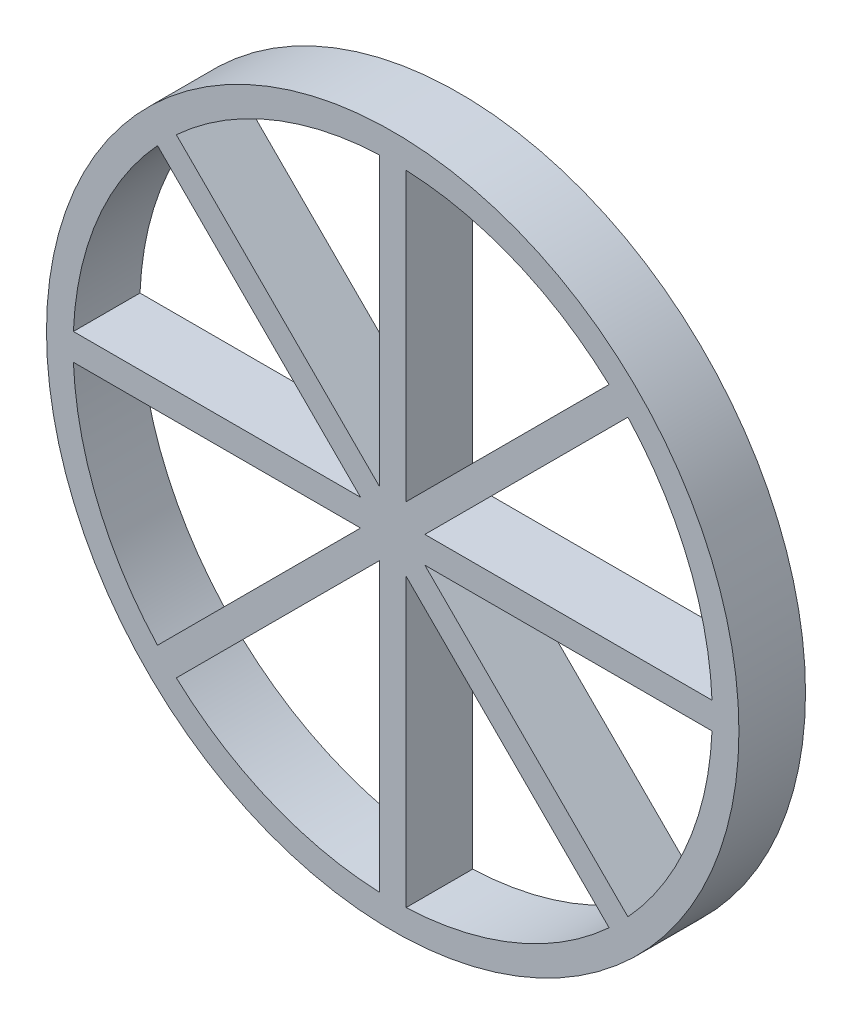
ISO-10303-21;
HEADER;
FILE_DESCRIPTION(('STEP AP214'),'2;1');
FILE_NAME('part.step','',(''),(''),'','','');
FILE_SCHEMA(('AUTOMOTIVE_DESIGN { 1 0 10303 214 1 1 1 1 }'));
ENDSEC;
DATA;
#1=APPLICATION_CONTEXT('core data for automotive mechanical design processes');
#2=APPLICATION_PROTOCOL_DEFINITION('international standard','automotive_design',2000,#1);
#3=PRODUCT_CONTEXT('',#1,'mechanical');
#4=PRODUCT('Part','Part','',(#3));
#5=PRODUCT_RELATED_PRODUCT_CATEGORY('part','',(#4));
#6=PRODUCT_DEFINITION_FORMATION('','',#4);
#7=PRODUCT_DEFINITION_CONTEXT('part definition',#1,'design');
#8=PRODUCT_DEFINITION('design','',#6,#7);
#9=PRODUCT_DEFINITION_SHAPE('','',#8);
#10=(LENGTH_UNIT() NAMED_UNIT(*) SI_UNIT(.MILLI.,.METRE.));
#11=(NAMED_UNIT(*) PLANE_ANGLE_UNIT() SI_UNIT($,.RADIAN.));
#12=(NAMED_UNIT(*) SI_UNIT($,.STERADIAN.) SOLID_ANGLE_UNIT());
#13=UNCERTAINTY_MEASURE_WITH_UNIT(LENGTH_MEASURE(1.E-05),#10,'distance_accuracy_value','');
#14=(GEOMETRIC_REPRESENTATION_CONTEXT(3) GLOBAL_UNCERTAINTY_ASSIGNED_CONTEXT((#13)) GLOBAL_UNIT_ASSIGNED_CONTEXT((#10,
#11,#12)) REPRESENTATION_CONTEXT('',''));
#15=CARTESIAN_POINT('',(0.,0.,0.));
#16=DIRECTION('',(0.,0.,1.));
#17=DIRECTION('',(1.,0.,0.));
#18=AXIS2_PLACEMENT_3D('',#15,#16,#17);
#19=CARTESIAN_POINT('',(0.,0.,10.));
#20=DIRECTION('',(0.,0.,-1.));
#21=DIRECTION('',(-1.,0.,0.));
#22=AXIS2_PLACEMENT_3D('',#19,#20,#21);
#23=PLANE('',#22);
#24=DIRECTION('',(0.,1.,0.));
#25=VECTOR('',#24,1.);
#26=CARTESIAN_POINT('',(-2.,0.,10.));
#27=LINE('',#26,#25);
#28=CARTESIAN_POINT('',(-2.,-4.82842712474619,10.));
#29=VERTEX_POINT('',#28);
#30=CARTESIAN_POINT('',(-2.,-47.9583152331272,10.));
#31=VERTEX_POINT('',#30);
#32=EDGE_CURVE('E496',#29,#31,#27,.F.);
#33=ORIENTED_EDGE('',*,*,#32,.T.);
#34=CARTESIAN_POINT('',(0.,0.,10.));
#35=DIRECTION('',(0.,0.,1.));
#36=DIRECTION('',(1.,0.,0.));
#37=AXIS2_PLACEMENT_3D('',#34,#35,#36);
#38=CIRCLE('',#37,48.);
#39=CARTESIAN_POINT('',(-32.4974363532532,-35.3258634779995,10.));
#40=VERTEX_POINT('',#39);
#41=EDGE_CURVE('E538',#40,#31,#38,.T.);
#42=ORIENTED_EDGE('',*,*,#41,.F.);
#43=DIRECTION('',(0.707106781186546,0.707106781186549,0.));
#44=VECTOR('',#43,1.);
#45=CARTESIAN_POINT('',(-33.9411254969542,-36.7695526217005,10.));
#46=LINE('',#45,#44);
#47=EDGE_CURVE('E694',#40,#29,#46,.T.);
#48=ORIENTED_EDGE('',*,*,#47,.T.);
#49=EDGE_LOOP('',(#33,#42,#48));
#50=FACE_BOUND('',#49,.T.);
#51=DIRECTION('',(1.,0.,0.));
#52=VECTOR('',#51,1.);
#53=CARTESIAN_POINT('',(0.,-2.,10.));
#54=LINE('',#53,#52);
#55=CARTESIAN_POINT('',(4.82842712474624,-2.,10.));
#56=VERTEX_POINT('',#55);
#57=CARTESIAN_POINT('',(47.9583152331272,-2.00000000000001,10.));
#58=VERTEX_POINT('',#57);
#59=EDGE_CURVE('E723',#56,#58,#54,.T.);
#60=ORIENTED_EDGE('',*,*,#59,.T.);
#61=CARTESIAN_POINT('',(35.3258634779996,-32.497436353253,10.));
#62=VERTEX_POINT('',#61);
#63=EDGE_CURVE('E525',#62,#58,#38,.T.);
#64=ORIENTED_EDGE('',*,*,#63,.F.);
#65=DIRECTION('',(0.707106781186552,-0.707106781186543,0.));
#66=VECTOR('',#65,1.);
#67=CARTESIAN_POINT('',(-33.9411254969545,36.7695526217003,10.));
#68=LINE('',#67,#66);
#69=EDGE_CURVE('E709',#56,#62,#68,.T.);
#70=ORIENTED_EDGE('',*,*,#69,.F.);
#71=EDGE_LOOP('',(#60,#64,#70));
#72=FACE_BOUND('',#71,.T.);
#73=DIRECTION('',(0.,1.,0.));
#74=VECTOR('',#73,1.);
#75=CARTESIAN_POINT('',(2.,0.,10.));
#76=LINE('',#75,#74);
#77=CARTESIAN_POINT('',(2.,4.8284271247462,10.));
#78=VERTEX_POINT('',#77);
#79=CARTESIAN_POINT('',(2.,47.9583152331272,10.));
#80=VERTEX_POINT('',#79);
#81=EDGE_CURVE('E717',#78,#80,#76,.T.);
#82=ORIENTED_EDGE('',*,*,#81,.T.);
#83=CARTESIAN_POINT('',(32.4974363532532,35.3258634779995,10.));
#84=VERTEX_POINT('',#83);
#85=EDGE_CURVE('E527',#84,#80,#38,.T.);
#86=ORIENTED_EDGE('',*,*,#85,.F.);
#87=DIRECTION('',(0.707106781186546,0.707106781186549,0.));
#88=VECTOR('',#87,1.);
#89=CARTESIAN_POINT('',(-36.7695526217004,-33.9411254969543,10.));
#90=LINE('',#89,#88);
#91=EDGE_CURVE('E692',#78,#84,#90,.T.);
#92=ORIENTED_EDGE('',*,*,#91,.F.);
#93=EDGE_LOOP('',(#82,#86,#92));
#94=FACE_BOUND('',#93,.T.);
#95=DIRECTION('',(0.,1.,0.));
#96=VECTOR('',#95,1.);
#97=CARTESIAN_POINT('',(2.,0.,10.));
#98=LINE('',#97,#96);
#99=CARTESIAN_POINT('',(2.,-4.82842712474615,10.));
#100=VERTEX_POINT('',#99);
#101=CARTESIAN_POINT('',(2.,-47.9583152331272,10.));
#102=VERTEX_POINT('',#101);
#103=EDGE_CURVE('E502',#100,#102,#98,.F.);
#104=ORIENTED_EDGE('',*,*,#103,.F.);
#105=DIRECTION('',(0.707106781186552,-0.707106781186543,0.));
#106=VECTOR('',#105,1.);
#107=CARTESIAN_POINT('',(-36.7695526217007,33.9411254969541,10.));
#108=LINE('',#107,#106);
#109=CARTESIAN_POINT('',(32.4974363532535,-35.3258634779992,10.));
#110=VERTEX_POINT('',#109);
#111=EDGE_CURVE('E523',#100,#110,#108,.T.);
#112=ORIENTED_EDGE('',*,*,#111,.T.);
#113=EDGE_CURVE('E517',#102,#110,#38,.T.);
#114=ORIENTED_EDGE('',*,*,#113,.F.);
#115=EDGE_LOOP('',(#104,#112,#114));
#116=FACE_BOUND('',#115,.T.);
#117=CARTESIAN_POINT('',(-35.3258634779996,32.4974363532531,10.));
#118=VERTEX_POINT('',#117);
#119=CARTESIAN_POINT('',(-47.9583152331272,1.99999999999999,10.));
#120=VERTEX_POINT('',#119);
#121=EDGE_CURVE('E533',#118,#120,#38,.T.);
#122=ORIENTED_EDGE('',*,*,#121,.F.);
#123=CARTESIAN_POINT('',(-4.82842712474622,2.,10.));
#124=VERTEX_POINT('',#123);
#125=EDGE_CURVE('E707',#118,#124,#108,.T.);
#126=ORIENTED_EDGE('',*,*,#125,.T.);
#127=DIRECTION('',(-1.,0.,0.));
#128=VECTOR('',#127,1.);
#129=CARTESIAN_POINT('',(0.,2.,10.));
#130=LINE('',#129,#128);
#131=EDGE_CURVE('E688',#124,#120,#130,.T.);
#132=ORIENTED_EDGE('',*,*,#131,.T.);
#133=EDGE_LOOP('',(#122,#126,#132));
#134=FACE_BOUND('',#133,.T.);
#135=CARTESIAN_POINT('',(47.9583152331272,1.99999999999999,10.));
#136=VERTEX_POINT('',#135);
#137=CARTESIAN_POINT('',(35.3258634779994,32.4974363532533,10.));
#138=VERTEX_POINT('',#137);
#139=EDGE_CURVE('E528',#136,#138,#38,.T.);
#140=ORIENTED_EDGE('',*,*,#139,.F.);
#141=DIRECTION('',(1.,0.,0.));
#142=VECTOR('',#141,1.);
#143=CARTESIAN_POINT('',(0.,2.,10.));
#144=LINE('',#143,#142);
#145=CARTESIAN_POINT('',(4.82842712474617,2.,10.));
#146=VERTEX_POINT('',#145);
#147=EDGE_CURVE('E623',#146,#136,#144,.T.);
#148=ORIENTED_EDGE('',*,*,#147,.F.);
#149=EDGE_CURVE('E697',#146,#138,#46,.T.);
#150=ORIENTED_EDGE('',*,*,#149,.T.);
#151=EDGE_LOOP('',(#140,#148,#150));
#152=FACE_BOUND('',#151,.T.);
#153=CARTESIAN_POINT('',(-32.4974363532534,35.3258634779993,10.));
#154=VERTEX_POINT('',#153);
#155=CARTESIAN_POINT('',(-2.,4.82842712474616,10.));
#156=VERTEX_POINT('',#155);
#157=EDGE_CURVE('E637',#154,#156,#68,.T.);
#158=ORIENTED_EDGE('',*,*,#157,.F.);
#159=CARTESIAN_POINT('',(-2.,47.9583152331272,10.));
#160=VERTEX_POINT('',#159);
#161=EDGE_CURVE('E537',#160,#154,#38,.T.);
#162=ORIENTED_EDGE('',*,*,#161,.F.);
#163=DIRECTION('',(0.,1.,0.));
#164=VECTOR('',#163,1.);
#165=CARTESIAN_POINT('',(-2.,0.,10.));
#166=LINE('',#165,#164);
#167=EDGE_CURVE('E630',#156,#160,#166,.T.);
#168=ORIENTED_EDGE('',*,*,#167,.F.);
#169=EDGE_LOOP('',(#158,#162,#168));
#170=FACE_BOUND('',#169,.T.);
#171=CARTESIAN_POINT('',(-47.9583152331272,-2.00000000000001,10.));
#172=VERTEX_POINT('',#171);
#173=CARTESIAN_POINT('',(-35.3258634779994,-32.4974363532533,10.));
#174=VERTEX_POINT('',#173);
#175=EDGE_CURVE('E534',#172,#174,#38,.T.);
#176=ORIENTED_EDGE('',*,*,#175,.F.);
#177=DIRECTION('',(-1.,0.,0.));
#178=VECTOR('',#177,1.);
#179=CARTESIAN_POINT('',(0.,-2.,10.));
#180=LINE('',#179,#178);
#181=CARTESIAN_POINT('',(-4.8284271247462,-2.00000000000001,10.));
#182=VERTEX_POINT('',#181);
#183=EDGE_CURVE('E652',#182,#172,#180,.T.);
#184=ORIENTED_EDGE('',*,*,#183,.F.);
#185=EDGE_CURVE('E659',#174,#182,#90,.T.);
#186=ORIENTED_EDGE('',*,*,#185,.F.);
#187=EDGE_LOOP('',(#176,#184,#186));
#188=FACE_BOUND('',#187,.T.);
#189=CARTESIAN_POINT('',(0.,0.,10.));
#190=DIRECTION('',(0.,0.,1.));
#191=DIRECTION('',(1.,0.,0.));
#192=AXIS2_PLACEMENT_3D('',#189,#190,#191);
#193=CIRCLE('',#192,52.);
#194=CARTESIAN_POINT('',(52.,0.,10.));
#195=VERTEX_POINT('',#194);
#196=EDGE_CURVE('E530',#195,#195,#193,.T.);
#197=ORIENTED_EDGE('',*,*,#196,.T.);
#198=EDGE_LOOP('',(#197));
#199=FACE_BOUND('',#198,.T.);
#200=ADVANCED_FACE('F375',(#50,#72,#94,#116,#134,#152,#170,#188,#199),#23,.F.);
#201=CARTESIAN_POINT('',(0.,0.,0.));
#202=DIRECTION('',(0.,0.,-1.));
#203=DIRECTION('',(-1.,0.,0.));
#204=AXIS2_PLACEMENT_3D('',#201,#202,#203);
#205=PLANE('',#204);
#206=CARTESIAN_POINT('',(0.,0.,0.));
#207=DIRECTION('',(0.,0.,1.));
#208=DIRECTION('',(1.,0.,0.));
#209=AXIS2_PLACEMENT_3D('',#206,#207,#208);
#210=CIRCLE('',#209,48.);
#211=CARTESIAN_POINT('',(-32.4974363532532,-35.3258634779995,0.));
#212=VERTEX_POINT('',#211);
#213=CARTESIAN_POINT('',(-2.,-47.9583152331272,0.));
#214=VERTEX_POINT('',#213);
#215=EDGE_CURVE('E578',#212,#214,#210,.T.);
#216=ORIENTED_EDGE('',*,*,#215,.T.);
#217=DIRECTION('',(0.,1.,0.));
#218=VECTOR('',#217,1.);
#219=CARTESIAN_POINT('',(-2.,0.,0.));
#220=LINE('',#219,#218);
#221=CARTESIAN_POINT('',(-2.,-4.82842712474619,0.));
#222=VERTEX_POINT('',#221);
#223=EDGE_CURVE('E610',#222,#214,#220,.F.);
#224=ORIENTED_EDGE('',*,*,#223,.F.);
#225=DIRECTION('',(0.707106781186546,0.707106781186549,0.));
#226=VECTOR('',#225,1.);
#227=CARTESIAN_POINT('',(-33.9411254969542,-36.7695526217005,0.));
#228=LINE('',#227,#226);
#229=EDGE_CURVE('E612',#212,#222,#228,.T.);
#230=ORIENTED_EDGE('',*,*,#229,.F.);
#231=EDGE_LOOP('',(#216,#224,#230));
#232=FACE_BOUND('',#231,.T.);
#233=CARTESIAN_POINT('',(35.3258634779996,-32.497436353253,0.));
#234=VERTEX_POINT('',#233);
#235=CARTESIAN_POINT('',(47.9583152331272,-2.00000000000001,0.));
#236=VERTEX_POINT('',#235);
#237=EDGE_CURVE('E566',#234,#236,#210,.T.);
#238=ORIENTED_EDGE('',*,*,#237,.T.);
#239=DIRECTION('',(1.,0.,0.));
#240=VECTOR('',#239,1.);
#241=CARTESIAN_POINT('',(0.,-2.,0.));
#242=LINE('',#241,#240);
#243=CARTESIAN_POINT('',(4.82842712474624,-2.,0.));
#244=VERTEX_POINT('',#243);
#245=EDGE_CURVE('E615',#244,#236,#242,.T.);
#246=ORIENTED_EDGE('',*,*,#245,.F.);
#247=DIRECTION('',(0.707106781186552,-0.707106781186543,0.));
#248=VECTOR('',#247,1.);
#249=CARTESIAN_POINT('',(-33.9411254969545,36.7695526217003,0.));
#250=LINE('',#249,#248);
#251=EDGE_CURVE('E714',#244,#234,#250,.T.);
#252=ORIENTED_EDGE('',*,*,#251,.T.);
#253=EDGE_LOOP('',(#238,#246,#252));
#254=FACE_BOUND('',#253,.T.);
#255=CARTESIAN_POINT('',(32.4974363532532,35.3258634779995,0.));
#256=VERTEX_POINT('',#255);
#257=CARTESIAN_POINT('',(2.,47.9583152331272,0.));
#258=VERTEX_POINT('',#257);
#259=EDGE_CURVE('E567',#256,#258,#210,.T.);
#260=ORIENTED_EDGE('',*,*,#259,.T.);
#261=DIRECTION('',(0.,1.,0.));
#262=VECTOR('',#261,1.);
#263=CARTESIAN_POINT('',(2.,0.,0.));
#264=LINE('',#263,#262);
#265=CARTESIAN_POINT('',(2.,4.8284271247462,0.));
#266=VERTEX_POINT('',#265);
#267=EDGE_CURVE('E626',#266,#258,#264,.T.);
#268=ORIENTED_EDGE('',*,*,#267,.F.);
#269=DIRECTION('',(0.707106781186546,0.707106781186549,0.));
#270=VECTOR('',#269,1.);
#271=CARTESIAN_POINT('',(-36.7695526217004,-33.9411254969543,0.));
#272=LINE('',#271,#270);
#273=EDGE_CURVE('E699',#266,#256,#272,.T.);
#274=ORIENTED_EDGE('',*,*,#273,.T.);
#275=EDGE_LOOP('',(#260,#268,#274));
#276=FACE_BOUND('',#275,.T.);
#277=DIRECTION('',(0.707106781186552,-0.707106781186543,0.));
#278=VECTOR('',#277,1.);
#279=CARTESIAN_POINT('',(-36.7695526217007,33.9411254969541,0.));
#280=LINE('',#279,#278);
#281=CARTESIAN_POINT('',(2.,-4.82842712474615,0.));
#282=VERTEX_POINT('',#281);
#283=CARTESIAN_POINT('',(32.4974363532535,-35.3258634779992,0.));
#284=VERTEX_POINT('',#283);
#285=EDGE_CURVE('E633',#282,#284,#280,.T.);
#286=ORIENTED_EDGE('',*,*,#285,.F.);
#287=DIRECTION('',(0.,1.,0.));
#288=VECTOR('',#287,1.);
#289=CARTESIAN_POINT('',(2.,0.,0.));
#290=LINE('',#289,#288);
#291=CARTESIAN_POINT('',(2.,-47.9583152331272,0.));
#292=VERTEX_POINT('',#291);
#293=EDGE_CURVE('E727',#282,#292,#290,.F.);
#294=ORIENTED_EDGE('',*,*,#293,.T.);
#295=EDGE_CURVE('E519',#292,#284,#210,.T.);
#296=ORIENTED_EDGE('',*,*,#295,.T.);
#297=EDGE_LOOP('',(#286,#294,#296));
#298=FACE_BOUND('',#297,.T.);
#299=CARTESIAN_POINT('',(-35.3258634779996,32.4974363532531,0.));
#300=VERTEX_POINT('',#299);
#301=CARTESIAN_POINT('',(-4.82842712474622,2.,0.));
#302=VERTEX_POINT('',#301);
#303=EDGE_CURVE('E713',#300,#302,#280,.T.);
#304=ORIENTED_EDGE('',*,*,#303,.F.);
#305=CARTESIAN_POINT('',(-47.9583152331272,1.99999999999999,0.));
#306=VERTEX_POINT('',#305);
#307=EDGE_CURVE('E573',#300,#306,#210,.T.);
#308=ORIENTED_EDGE('',*,*,#307,.T.);
#309=DIRECTION('',(-1.,0.,0.));
#310=VECTOR('',#309,1.);
#311=CARTESIAN_POINT('',(0.,2.,0.));
#312=LINE('',#311,#310);
#313=EDGE_CURVE('E646',#302,#306,#312,.T.);
#314=ORIENTED_EDGE('',*,*,#313,.F.);
#315=EDGE_LOOP('',(#304,#308,#314));
#316=FACE_BOUND('',#315,.T.);
#317=DIRECTION('',(1.,0.,0.));
#318=VECTOR('',#317,1.);
#319=CARTESIAN_POINT('',(0.,2.,0.));
#320=LINE('',#319,#318);
#321=CARTESIAN_POINT('',(4.82842712474617,2.,0.));
#322=VERTEX_POINT('',#321);
#323=CARTESIAN_POINT('',(47.9583152331272,1.99999999999999,0.));
#324=VERTEX_POINT('',#323);
#325=EDGE_CURVE('E617',#322,#324,#320,.T.);
#326=ORIENTED_EDGE('',*,*,#325,.T.);
#327=CARTESIAN_POINT('',(35.3258634779994,32.4974363532533,0.));
#328=VERTEX_POINT('',#327);
#329=EDGE_CURVE('E568',#324,#328,#210,.T.);
#330=ORIENTED_EDGE('',*,*,#329,.T.);
#331=EDGE_CURVE('E656',#322,#328,#228,.T.);
#332=ORIENTED_EDGE('',*,*,#331,.F.);
#333=EDGE_LOOP('',(#326,#330,#332));
#334=FACE_BOUND('',#333,.T.);
#335=CARTESIAN_POINT('',(-2.,47.9583152331272,0.));
#336=VERTEX_POINT('',#335);
#337=CARTESIAN_POINT('',(-32.4974363532534,35.3258634779993,0.));
#338=VERTEX_POINT('',#337);
#339=EDGE_CURVE('E577',#336,#338,#210,.T.);
#340=ORIENTED_EDGE('',*,*,#339,.T.);
#341=CARTESIAN_POINT('',(-2.,4.82842712474616,0.));
#342=VERTEX_POINT('',#341);
#343=EDGE_CURVE('E708',#338,#342,#250,.T.);
#344=ORIENTED_EDGE('',*,*,#343,.T.);
#345=DIRECTION('',(0.,1.,0.));
#346=VECTOR('',#345,1.);
#347=CARTESIAN_POINT('',(-2.,0.,0.));
#348=LINE('',#347,#346);
#349=EDGE_CURVE('E719',#342,#336,#348,.T.);
#350=ORIENTED_EDGE('',*,*,#349,.T.);
#351=EDGE_LOOP('',(#340,#344,#350));
#352=FACE_BOUND('',#351,.T.);
#353=DIRECTION('',(-1.,0.,0.));
#354=VECTOR('',#353,1.);
#355=CARTESIAN_POINT('',(0.,-2.,0.));
#356=LINE('',#355,#354);
#357=CARTESIAN_POINT('',(-4.8284271247462,-2.00000000000001,0.));
#358=VERTEX_POINT('',#357);
#359=CARTESIAN_POINT('',(-47.9583152331272,-2.00000000000001,0.));
#360=VERTEX_POINT('',#359);
#361=EDGE_CURVE('E683',#358,#360,#356,.T.);
#362=ORIENTED_EDGE('',*,*,#361,.T.);
#363=CARTESIAN_POINT('',(-35.3258634779994,-32.4974363532533,0.));
#364=VERTEX_POINT('',#363);
#365=EDGE_CURVE('E574',#360,#364,#210,.T.);
#366=ORIENTED_EDGE('',*,*,#365,.T.);
#367=EDGE_CURVE('E702',#364,#358,#272,.T.);
#368=ORIENTED_EDGE('',*,*,#367,.T.);
#369=EDGE_LOOP('',(#362,#366,#368));
#370=FACE_BOUND('',#369,.T.);
#371=CARTESIAN_POINT('',(0.,0.,0.));
#372=DIRECTION('',(0.,0.,1.));
#373=DIRECTION('',(1.,0.,0.));
#374=AXIS2_PLACEMENT_3D('',#371,#372,#373);
#375=CIRCLE('',#374,52.);
#376=CARTESIAN_POINT('',(52.,0.,0.));
#377=VERTEX_POINT('',#376);
#378=EDGE_CURVE('E524',#377,#377,#375,.T.);
#379=ORIENTED_EDGE('',*,*,#378,.F.);
#380=EDGE_LOOP('',(#379));
#381=FACE_BOUND('',#380,.T.);
#382=ADVANCED_FACE('F607',(#232,#254,#276,#298,#316,#334,#352,#370,#381),#205,.T.);
#383=CARTESIAN_POINT('',(-33.9411254969545,36.7695526217003,10.));
#384=DIRECTION('',(0.707106781186543,0.707106781186552,0.));
#385=DIRECTION('',(-0.707106781186552,0.707106781186543,0.));
#386=AXIS2_PLACEMENT_3D('',#383,#384,#385);
#387=PLANE('',#386);
#388=ORIENTED_EDGE('',*,*,#251,.F.);
#389=DIRECTION('',(0.,0.,1.));
#390=VECTOR('',#389,1.);
#391=CARTESIAN_POINT('',(4.82842712474624,-2.,10.));
#392=LINE('',#391,#390);
#393=EDGE_CURVE('E644',#244,#56,#392,.T.);
#394=ORIENTED_EDGE('',*,*,#393,.T.);
#395=ORIENTED_EDGE('',*,*,#69,.T.);
#396=DIRECTION('',(0.,0.,-1.));
#397=VECTOR('',#396,1.);
#398=CARTESIAN_POINT('',(35.3258634779996,-32.497436353253,10.));
#399=LINE('',#398,#397);
#400=EDGE_CURVE('E636',#234,#62,#399,.F.);
#401=ORIENTED_EDGE('',*,*,#400,.F.);
#402=EDGE_LOOP('',(#388,#394,#395,#401));
#403=FACE_BOUND('',#402,.T.);
#404=ADVANCED_FACE('F733',(#403),#387,.T.);
#405=CARTESIAN_POINT('',(-36.7695526217007,33.9411254969541,10.));
#406=DIRECTION('',(0.707106781186543,0.707106781186552,0.));
#407=DIRECTION('',(-0.707106781186552,0.707106781186543,0.));
#408=AXIS2_PLACEMENT_3D('',#405,#406,#407);
#409=PLANE('',#408);
#410=ORIENTED_EDGE('',*,*,#285,.T.);
#411=DIRECTION('',(0.,0.,-1.));
#412=VECTOR('',#411,1.);
#413=CARTESIAN_POINT('',(32.4974363532535,-35.3258634779992,10.));
#414=LINE('',#413,#412);
#415=EDGE_CURVE('E642',#284,#110,#414,.F.);
#416=ORIENTED_EDGE('',*,*,#415,.T.);
#417=ORIENTED_EDGE('',*,*,#111,.F.);
#418=DIRECTION('',(0.,0.,-1.));
#419=VECTOR('',#418,1.);
#420=CARTESIAN_POINT('',(2.,-4.82842712474615,10.));
#421=LINE('',#420,#419);
#422=EDGE_CURVE('E508',#100,#282,#421,.T.);
#423=ORIENTED_EDGE('',*,*,#422,.T.);
#424=EDGE_LOOP('',(#410,#416,#417,#423));
#425=FACE_BOUND('',#424,.T.);
#426=ADVANCED_FACE('F730',(#425),#409,.F.);
#427=DIRECTION('',(0.,0.,1.));
#428=VECTOR('',#427,1.);
#429=CARTESIAN_POINT('',(-2.,4.82842712474616,10.));
#430=LINE('',#429,#428);
#431=EDGE_CURVE('E640',#342,#156,#430,.T.);
#432=ORIENTED_EDGE('',*,*,#431,.F.);
#433=ORIENTED_EDGE('',*,*,#343,.F.);
#434=DIRECTION('',(0.,0.,-1.));
#435=VECTOR('',#434,1.);
#436=CARTESIAN_POINT('',(-32.4974363532534,35.3258634779993,10.));
#437=LINE('',#436,#435);
#438=EDGE_CURVE('E634',#154,#338,#437,.T.);
#439=ORIENTED_EDGE('',*,*,#438,.F.);
#440=ORIENTED_EDGE('',*,*,#157,.T.);
#441=EDGE_LOOP('',(#432,#433,#439,#440));
#442=FACE_BOUND('',#441,.T.);
#443=ADVANCED_FACE('F732',(#442),#387,.T.);
#444=ORIENTED_EDGE('',*,*,#303,.T.);
#445=DIRECTION('',(0.,0.,1.));
#446=VECTOR('',#445,1.);
#447=CARTESIAN_POINT('',(-4.82842712474623,2.,10.));
#448=LINE('',#447,#446);
#449=EDGE_CURVE('E654',#302,#124,#448,.T.);
#450=ORIENTED_EDGE('',*,*,#449,.T.);
#451=ORIENTED_EDGE('',*,*,#125,.F.);
#452=DIRECTION('',(0.,0.,-1.));
#453=VECTOR('',#452,1.);
#454=CARTESIAN_POINT('',(-35.3258634779996,32.4974363532531,10.));
#455=LINE('',#454,#453);
#456=EDGE_CURVE('E638',#118,#300,#455,.T.);
#457=ORIENTED_EDGE('',*,*,#456,.T.);
#458=EDGE_LOOP('',(#444,#450,#451,#457));
#459=FACE_BOUND('',#458,.T.);
#460=ADVANCED_FACE('F735',(#459),#409,.F.);
#461=CARTESIAN_POINT('',(0.,2.,10.));
#462=DIRECTION('',(0.,-1.,0.));
#463=DIRECTION('',(1.,0.,0.));
#464=AXIS2_PLACEMENT_3D('',#461,#462,#463);
#465=PLANE('',#464);
#466=ORIENTED_EDGE('',*,*,#449,.F.);
#467=ORIENTED_EDGE('',*,*,#313,.T.);
#468=DIRECTION('',(0.,0.,-1.));
#469=VECTOR('',#468,1.);
#470=CARTESIAN_POINT('',(-47.9583152331272,1.99999999999999,10.));
#471=LINE('',#470,#469);
#472=EDGE_CURVE('E651',#306,#120,#471,.F.);
#473=ORIENTED_EDGE('',*,*,#472,.T.);
#474=ORIENTED_EDGE('',*,*,#131,.F.);
#475=EDGE_LOOP('',(#466,#467,#473,#474));
#476=FACE_BOUND('',#475,.T.);
#477=ADVANCED_FACE('F745',(#476),#465,.F.);
#478=CARTESIAN_POINT('',(0.,-2.,10.));
#479=DIRECTION('',(0.,1.,0.));
#480=DIRECTION('',(-1.,0.,0.));
#481=AXIS2_PLACEMENT_3D('',#478,#479,#480);
#482=PLANE('',#481);
#483=ORIENTED_EDGE('',*,*,#393,.F.);
#484=ORIENTED_EDGE('',*,*,#245,.T.);
#485=DIRECTION('',(0.,0.,-1.));
#486=VECTOR('',#485,1.);
#487=CARTESIAN_POINT('',(47.9583152331272,-2.00000000000001,10.));
#488=LINE('',#487,#486);
#489=EDGE_CURVE('E622',#236,#58,#488,.F.);
#490=ORIENTED_EDGE('',*,*,#489,.T.);
#491=ORIENTED_EDGE('',*,*,#59,.F.);
#492=EDGE_LOOP('',(#483,#484,#490,#491));
#493=FACE_BOUND('',#492,.T.);
#494=ADVANCED_FACE('F916',(#493),#482,.F.);
#495=CARTESIAN_POINT('',(0.,2.,10.));
#496=DIRECTION('',(0.,1.,0.));
#497=DIRECTION('',(-1.,0.,0.));
#498=AXIS2_PLACEMENT_3D('',#495,#496,#497);
#499=PLANE('',#498);
#500=DIRECTION('',(0.,0.,-1.));
#501=VECTOR('',#500,1.);
#502=CARTESIAN_POINT('',(4.82842712474617,2.,10.));
#503=LINE('',#502,#501);
#504=EDGE_CURVE('E12',#146,#322,#503,.T.);
#505=ORIENTED_EDGE('',*,*,#504,.F.);
#506=ORIENTED_EDGE('',*,*,#147,.T.);
#507=DIRECTION('',(0.,0.,-1.));
#508=VECTOR('',#507,1.);
#509=CARTESIAN_POINT('',(47.9583152331272,1.99999999999999,10.));
#510=LINE('',#509,#508);
#511=EDGE_CURVE('E620',#324,#136,#510,.F.);
#512=ORIENTED_EDGE('',*,*,#511,.F.);
#513=ORIENTED_EDGE('',*,*,#325,.F.);
#514=EDGE_LOOP('',(#505,#506,#512,#513));
#515=FACE_BOUND('',#514,.T.);
#516=ADVANCED_FACE('F807',(#515),#499,.T.);
#517=CARTESIAN_POINT('',(2.,0.,10.));
#518=DIRECTION('',(-1.,0.,0.));
#519=DIRECTION('',(0.,0.,1.));
#520=AXIS2_PLACEMENT_3D('',#517,#518,#519);
#521=PLANE('',#520);
#522=DIRECTION('',(0.,0.,1.));
#523=VECTOR('',#522,1.);
#524=CARTESIAN_POINT('',(2.,4.82842712474621,10.));
#525=LINE('',#524,#523);
#526=EDGE_CURVE('E667',#266,#78,#525,.T.);
#527=ORIENTED_EDGE('',*,*,#526,.F.);
#528=ORIENTED_EDGE('',*,*,#267,.T.);
#529=DIRECTION('',(0.,0.,-1.));
#530=VECTOR('',#529,1.);
#531=CARTESIAN_POINT('',(2.,47.9583152331272,10.));
#532=LINE('',#531,#530);
#533=EDGE_CURVE('E629',#258,#80,#532,.F.);
#534=ORIENTED_EDGE('',*,*,#533,.T.);
#535=ORIENTED_EDGE('',*,*,#81,.F.);
#536=EDGE_LOOP('',(#527,#528,#534,#535));
#537=FACE_BOUND('',#536,.T.);
#538=ADVANCED_FACE('F800',(#537),#521,.F.);
#539=CARTESIAN_POINT('',(0.,0.,10.));
#540=DIRECTION('',(0.,0.,-1.));
#541=DIRECTION('',(-1.,0.,0.));
#542=AXIS2_PLACEMENT_3D('',#539,#540,#541);
#543=CYLINDRICAL_SURFACE('',#542,48.);
#544=ORIENTED_EDGE('',*,*,#175,.T.);
#545=DIRECTION('',(0.,0.,-1.));
#546=VECTOR('',#545,1.);
#547=CARTESIAN_POINT('',(-35.3258634779994,-32.4974363532533,10.));
#548=LINE('',#547,#546);
#549=EDGE_CURVE('E657',#174,#364,#548,.T.);
#550=ORIENTED_EDGE('',*,*,#549,.T.);
#551=ORIENTED_EDGE('',*,*,#365,.F.);
#552=DIRECTION('',(0.,0.,-1.));
#553=VECTOR('',#552,1.);
#554=CARTESIAN_POINT('',(-47.9583152331272,-2.00000000000001,10.));
#555=LINE('',#554,#553);
#556=EDGE_CURVE('E649',#360,#172,#555,.F.);
#557=ORIENTED_EDGE('',*,*,#556,.T.);
#558=EDGE_LOOP('',(#544,#550,#551,#557));
#559=FACE_BOUND('',#558,.T.);
#560=ADVANCED_FACE('F797',(#559),#543,.F.);
#561=ORIENTED_EDGE('',*,*,#472,.F.);
#562=ORIENTED_EDGE('',*,*,#307,.F.);
#563=ORIENTED_EDGE('',*,*,#456,.F.);
#564=ORIENTED_EDGE('',*,*,#121,.T.);
#565=EDGE_LOOP('',(#561,#562,#563,#564));
#566=FACE_BOUND('',#565,.T.);
#567=ADVANCED_FACE('F799',(#566),#543,.F.);
#568=ORIENTED_EDGE('',*,*,#161,.T.);
#569=ORIENTED_EDGE('',*,*,#438,.T.);
#570=ORIENTED_EDGE('',*,*,#339,.F.);
#571=DIRECTION('',(0.,0.,-1.));
#572=VECTOR('',#571,1.);
#573=CARTESIAN_POINT('',(-2.,47.9583152331272,10.));
#574=LINE('',#573,#572);
#575=EDGE_CURVE('E627',#336,#160,#574,.F.);
#576=ORIENTED_EDGE('',*,*,#575,.T.);
#577=EDGE_LOOP('',(#568,#569,#570,#576));
#578=FACE_BOUND('',#577,.T.);
#579=ADVANCED_FACE('F806',(#578),#543,.F.);
#580=ORIENTED_EDGE('',*,*,#259,.F.);
#581=DIRECTION('',(0.,0.,-1.));
#582=VECTOR('',#581,1.);
#583=CARTESIAN_POINT('',(32.4974363532532,35.3258634779995,10.));
#584=LINE('',#583,#582);
#585=EDGE_CURVE('E393',#256,#84,#584,.F.);
#586=ORIENTED_EDGE('',*,*,#585,.T.);
#587=ORIENTED_EDGE('',*,*,#85,.T.);
#588=ORIENTED_EDGE('',*,*,#533,.F.);
#589=EDGE_LOOP('',(#580,#586,#587,#588));
#590=FACE_BOUND('',#589,.T.);
#591=ADVANCED_FACE('F801',(#590),#543,.F.);
#592=DIRECTION('',(0.,0.,-1.));
#593=VECTOR('',#592,1.);
#594=CARTESIAN_POINT('',(35.3258634779994,32.4974363532533,10.));
#595=LINE('',#594,#593);
#596=EDGE_CURVE('E385',#328,#138,#595,.F.);
#597=ORIENTED_EDGE('',*,*,#596,.F.);
#598=ORIENTED_EDGE('',*,*,#329,.F.);
#599=ORIENTED_EDGE('',*,*,#511,.T.);
#600=ORIENTED_EDGE('',*,*,#139,.T.);
#601=EDGE_LOOP('',(#597,#598,#599,#600));
#602=FACE_BOUND('',#601,.T.);
#603=ADVANCED_FACE('F785',(#602),#543,.F.);
#604=ORIENTED_EDGE('',*,*,#237,.F.);
#605=ORIENTED_EDGE('',*,*,#400,.T.);
#606=ORIENTED_EDGE('',*,*,#63,.T.);
#607=ORIENTED_EDGE('',*,*,#489,.F.);
#608=EDGE_LOOP('',(#604,#605,#606,#607));
#609=FACE_BOUND('',#608,.T.);
#610=ADVANCED_FACE('F812',(#609),#543,.F.);
#611=ORIENTED_EDGE('',*,*,#415,.F.);
#612=ORIENTED_EDGE('',*,*,#295,.F.);
#613=DIRECTION('',(0.,0.,-1.));
#614=VECTOR('',#613,1.);
#615=CARTESIAN_POINT('',(2.,-47.9583152331272,10.));
#616=LINE('',#615,#614);
#617=EDGE_CURVE('E506',#292,#102,#616,.F.);
#618=ORIENTED_EDGE('',*,*,#617,.T.);
#619=ORIENTED_EDGE('',*,*,#113,.T.);
#620=EDGE_LOOP('',(#611,#612,#618,#619));
#621=FACE_BOUND('',#620,.T.);
#622=ADVANCED_FACE('F516',(#621),#543,.F.);
#623=DIRECTION('',(0.,0.,-1.));
#624=VECTOR('',#623,1.);
#625=CARTESIAN_POINT('',(-32.4974363532532,-35.3258634779995,10.));
#626=LINE('',#625,#624);
#627=EDGE_CURVE('E660',#40,#212,#626,.T.);
#628=ORIENTED_EDGE('',*,*,#627,.F.);
#629=ORIENTED_EDGE('',*,*,#41,.T.);
#630=DIRECTION('',(0.,0.,-1.));
#631=VECTOR('',#630,1.);
#632=CARTESIAN_POINT('',(-2.,-47.9583152331272,10.));
#633=LINE('',#632,#631);
#634=EDGE_CURVE('E520',#214,#31,#633,.F.);
#635=ORIENTED_EDGE('',*,*,#634,.F.);
#636=ORIENTED_EDGE('',*,*,#215,.F.);
#637=EDGE_LOOP('',(#628,#629,#635,#636));
#638=FACE_BOUND('',#637,.T.);
#639=ADVANCED_FACE('F613',(#638),#543,.F.);
#640=CARTESIAN_POINT('',(0.,0.,10.));
#641=DIRECTION('',(0.,0.,-1.));
#642=DIRECTION('',(-1.,0.,0.));
#643=AXIS2_PLACEMENT_3D('',#640,#641,#642);
#644=CYLINDRICAL_SURFACE('',#643,52.);
#645=ORIENTED_EDGE('',*,*,#196,.F.);
#646=EDGE_LOOP('',(#645));
#647=FACE_BOUND('',#646,.T.);
#648=ORIENTED_EDGE('',*,*,#378,.T.);
#649=EDGE_LOOP('',(#648));
#650=FACE_BOUND('',#649,.T.);
#651=ADVANCED_FACE('F377',(#647,#650),#644,.T.);
#652=CARTESIAN_POINT('',(2.,0.,10.));
#653=DIRECTION('',(1.,0.,0.));
#654=DIRECTION('',(0.,0.,-1.));
#655=AXIS2_PLACEMENT_3D('',#652,#653,#654);
#656=PLANE('',#655);
#657=ORIENTED_EDGE('',*,*,#422,.F.);
#658=ORIENTED_EDGE('',*,*,#103,.T.);
#659=ORIENTED_EDGE('',*,*,#617,.F.);
#660=ORIENTED_EDGE('',*,*,#293,.F.);
#661=EDGE_LOOP('',(#657,#658,#659,#660));
#662=FACE_BOUND('',#661,.T.);
#663=ADVANCED_FACE('F504',(#662),#656,.T.);
#664=CARTESIAN_POINT('',(-2.,0.,10.));
#665=DIRECTION('',(1.,0.,0.));
#666=DIRECTION('',(0.,0.,-1.));
#667=AXIS2_PLACEMENT_3D('',#664,#665,#666);
#668=PLANE('',#667);
#669=ORIENTED_EDGE('',*,*,#32,.F.);
#670=DIRECTION('',(0.,0.,-1.));
#671=VECTOR('',#670,1.);
#672=CARTESIAN_POINT('',(-2.,-4.8284271247462,10.));
#673=LINE('',#672,#671);
#674=EDGE_CURVE('E663',#29,#222,#673,.T.);
#675=ORIENTED_EDGE('',*,*,#674,.T.);
#676=ORIENTED_EDGE('',*,*,#223,.T.);
#677=ORIENTED_EDGE('',*,*,#634,.T.);
#678=EDGE_LOOP('',(#669,#675,#676,#677));
#679=FACE_BOUND('',#678,.T.);
#680=ADVANCED_FACE('F867',(#679),#668,.F.);
#681=CARTESIAN_POINT('',(-2.,0.,10.));
#682=DIRECTION('',(-1.,0.,0.));
#683=DIRECTION('',(0.,0.,1.));
#684=AXIS2_PLACEMENT_3D('',#681,#682,#683);
#685=PLANE('',#684);
#686=ORIENTED_EDGE('',*,*,#349,.F.);
#687=ORIENTED_EDGE('',*,*,#431,.T.);
#688=ORIENTED_EDGE('',*,*,#167,.T.);
#689=ORIENTED_EDGE('',*,*,#575,.F.);
#690=EDGE_LOOP('',(#686,#687,#688,#689));
#691=FACE_BOUND('',#690,.T.);
#692=ADVANCED_FACE('F758',(#691),#685,.T.);
#693=CARTESIAN_POINT('',(0.,-2.,10.));
#694=DIRECTION('',(0.,-1.,0.));
#695=DIRECTION('',(1.,0.,0.));
#696=AXIS2_PLACEMENT_3D('',#693,#694,#695);
#697=PLANE('',#696);
#698=ORIENTED_EDGE('',*,*,#361,.F.);
#699=DIRECTION('',(0.,0.,1.));
#700=VECTOR('',#699,1.);
#701=CARTESIAN_POINT('',(-4.82842712474618,-2.,10.));
#702=LINE('',#701,#700);
#703=EDGE_CURVE('E379',#358,#182,#702,.T.);
#704=ORIENTED_EDGE('',*,*,#703,.T.);
#705=ORIENTED_EDGE('',*,*,#183,.T.);
#706=ORIENTED_EDGE('',*,*,#556,.F.);
#707=EDGE_LOOP('',(#698,#704,#705,#706));
#708=FACE_BOUND('',#707,.T.);
#709=ADVANCED_FACE('F680',(#708),#697,.T.);
#710=CARTESIAN_POINT('',(-36.7695526217004,-33.9411254969543,10.));
#711=DIRECTION('',(-0.707106781186549,0.707106781186546,0.));
#712=DIRECTION('',(-0.707106781186546,-0.707106781186549,0.));
#713=AXIS2_PLACEMENT_3D('',#710,#711,#712);
#714=PLANE('',#713);
#715=ORIENTED_EDGE('',*,*,#703,.F.);
#716=ORIENTED_EDGE('',*,*,#367,.F.);
#717=ORIENTED_EDGE('',*,*,#549,.F.);
#718=ORIENTED_EDGE('',*,*,#185,.T.);
#719=EDGE_LOOP('',(#715,#716,#717,#718));
#720=FACE_BOUND('',#719,.T.);
#721=ADVANCED_FACE('F691',(#720),#714,.T.);
#722=CARTESIAN_POINT('',(-33.9411254969542,-36.7695526217005,10.));
#723=DIRECTION('',(-0.707106781186549,0.707106781186546,0.));
#724=DIRECTION('',(-0.707106781186546,-0.707106781186549,0.));
#725=AXIS2_PLACEMENT_3D('',#722,#723,#724);
#726=PLANE('',#725);
#727=ORIENTED_EDGE('',*,*,#674,.F.);
#728=ORIENTED_EDGE('',*,*,#47,.F.);
#729=ORIENTED_EDGE('',*,*,#627,.T.);
#730=ORIENTED_EDGE('',*,*,#229,.T.);
#731=EDGE_LOOP('',(#727,#728,#729,#730));
#732=FACE_BOUND('',#731,.T.);
#733=ADVANCED_FACE('F748',(#732),#726,.F.);
#734=ORIENTED_EDGE('',*,*,#273,.F.);
#735=ORIENTED_EDGE('',*,*,#526,.T.);
#736=ORIENTED_EDGE('',*,*,#91,.T.);
#737=ORIENTED_EDGE('',*,*,#585,.F.);
#738=EDGE_LOOP('',(#734,#735,#736,#737));
#739=FACE_BOUND('',#738,.T.);
#740=ADVANCED_FACE('F750',(#739),#714,.T.);
#741=ORIENTED_EDGE('',*,*,#149,.F.);
#742=ORIENTED_EDGE('',*,*,#504,.T.);
#743=ORIENTED_EDGE('',*,*,#331,.T.);
#744=ORIENTED_EDGE('',*,*,#596,.T.);
#745=EDGE_LOOP('',(#741,#742,#743,#744));
#746=FACE_BOUND('',#745,.T.);
#747=ADVANCED_FACE('F757',(#746),#726,.F.);
#748=CLOSED_SHELL('',(#200,#382,#404,#426,#443,#460,#477,#494,#516,#538,#560,#567,#579,#591,
#603,#610,#622,#639,#651,#663,#680,#692,#709,#721,#733,#740,#747));
#749=MANIFOLD_SOLID_BREP('B2',#748);
#750=ADVANCED_BREP_SHAPE_REPRESENTATION('',(#18,#749),#14);
#751=SHAPE_DEFINITION_REPRESENTATION(#9,#750);
ENDSEC;
END-ISO-10303-21;
